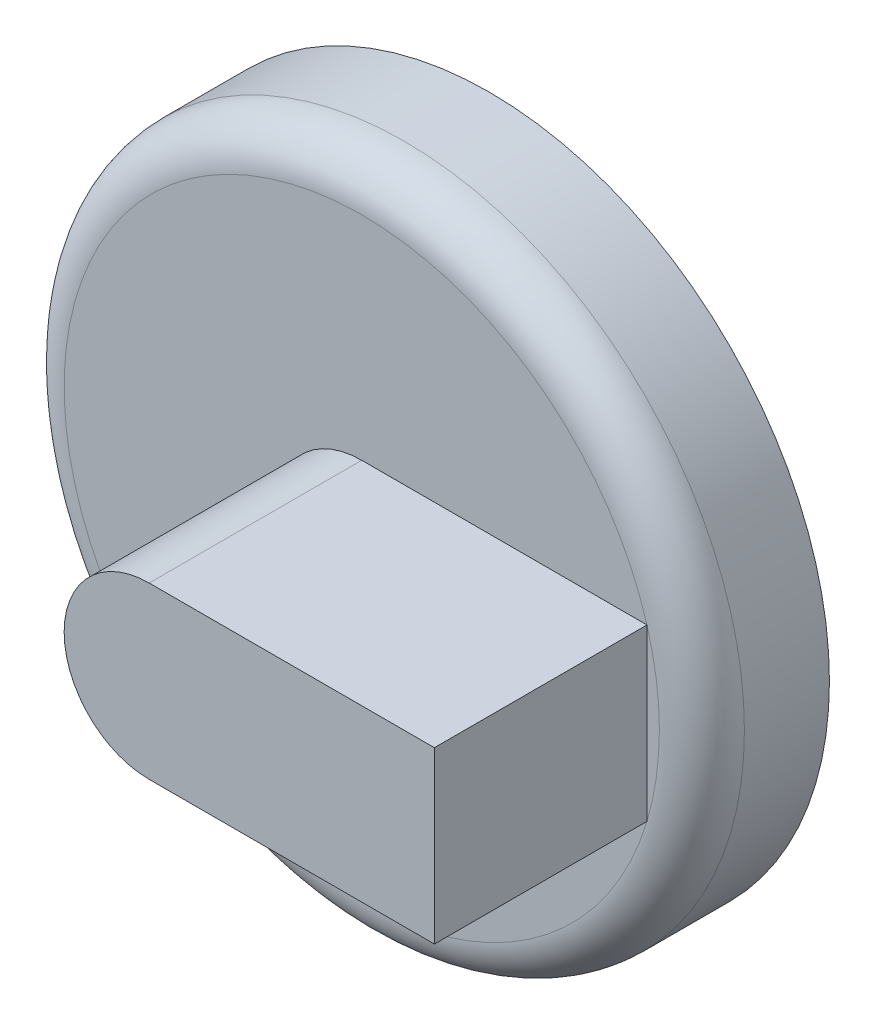
ISO-10303-21;
HEADER;
FILE_DESCRIPTION(('STEP AP214'),'2;1');
FILE_NAME('part.step','',(''),(''),'','','');
FILE_SCHEMA(('AUTOMOTIVE_DESIGN { 1 0 10303 214 1 1 1 1 }'));
ENDSEC;
DATA;
#1=APPLICATION_CONTEXT('core data for automotive mechanical design processes');
#2=APPLICATION_PROTOCOL_DEFINITION('international standard','automotive_design',2000,#1);
#3=PRODUCT_CONTEXT('',#1,'mechanical');
#4=PRODUCT('Part','Part','',(#3));
#5=PRODUCT_RELATED_PRODUCT_CATEGORY('part','',(#4));
#6=PRODUCT_DEFINITION_FORMATION('','',#4);
#7=PRODUCT_DEFINITION_CONTEXT('part definition',#1,'design');
#8=PRODUCT_DEFINITION('design','',#6,#7);
#9=PRODUCT_DEFINITION_SHAPE('','',#8);
#10=(LENGTH_UNIT() NAMED_UNIT(*) SI_UNIT(.MILLI.,.METRE.));
#11=(NAMED_UNIT(*) PLANE_ANGLE_UNIT() SI_UNIT($,.RADIAN.));
#12=(NAMED_UNIT(*) SI_UNIT($,.STERADIAN.) SOLID_ANGLE_UNIT());
#13=UNCERTAINTY_MEASURE_WITH_UNIT(LENGTH_MEASURE(1.E-05),#10,'distance_accuracy_value','');
#14=(GEOMETRIC_REPRESENTATION_CONTEXT(3) GLOBAL_UNCERTAINTY_ASSIGNED_CONTEXT((#13)) GLOBAL_UNIT_ASSIGNED_CONTEXT((#10,
#11,#12)) REPRESENTATION_CONTEXT('',''));
#15=CARTESIAN_POINT('',(0.,0.,0.));
#16=DIRECTION('',(0.,0.,1.));
#17=DIRECTION('',(1.,0.,0.));
#18=AXIS2_PLACEMENT_3D('',#15,#16,#17);
#19=CARTESIAN_POINT('',(0.,0.,20.6849186801268));
#20=DIRECTION('',(0.,0.,1.));
#21=DIRECTION('',(1.,0.,0.));
#22=AXIS2_PLACEMENT_3D('',#19,#20,#21);
#23=PLANE('',#22);
#24=DIRECTION('',(-1.,0.,0.));
#25=VECTOR('',#24,1.);
#26=CARTESIAN_POINT('',(0.,20.,20.6849186801268));
#27=LINE('',#26,#25);
#28=CARTESIAN_POINT('',(67.0820393249937,20.,20.6849186801268));
#29=VERTEX_POINT('',#28);
#30=CARTESIAN_POINT('',(0.,20.,20.6849186801268));
#31=VERTEX_POINT('',#30);
#32=EDGE_CURVE('E64',#29,#31,#27,.T.);
#33=ORIENTED_EDGE('',*,*,#32,.F.);
#34=CARTESIAN_POINT('',(0.,0.,20.6849186801268));
#35=DIRECTION('',(0.,0.,1.));
#36=DIRECTION('',(1.,0.,0.));
#37=AXIS2_PLACEMENT_3D('',#34,#35,#36);
#38=CIRCLE('',#37,70.);
#39=CARTESIAN_POINT('',(67.0820393249937,-20.,20.6849186801268));
#40=VERTEX_POINT('',#39);
#41=EDGE_CURVE('E49',#29,#40,#38,.T.);
#42=ORIENTED_EDGE('',*,*,#41,.T.);
#43=DIRECTION('',(1.,0.,0.));
#44=VECTOR('',#43,1.);
#45=CARTESIAN_POINT('',(0.,-20.,20.6849186801268));
#46=LINE('',#45,#44);
#47=CARTESIAN_POINT('',(0.,-20.,20.6849186801268));
#48=VERTEX_POINT('',#47);
#49=EDGE_CURVE('E97',#48,#40,#46,.T.);
#50=ORIENTED_EDGE('',*,*,#49,.F.);
#51=CARTESIAN_POINT('',(0.,0.,20.6849186801268));
#52=DIRECTION('',(0.,0.,1.));
#53=DIRECTION('',(1.,0.,0.));
#54=AXIS2_PLACEMENT_3D('',#51,#52,#53);
#55=CIRCLE('',#54,20.);
#56=EDGE_CURVE('E117',#31,#48,#55,.T.);
#57=ORIENTED_EDGE('',*,*,#56,.F.);
#58=EDGE_LOOP('',(#33,#42,#50,#57));
#59=FACE_BOUND('',#58,.T.);
#60=ADVANCED_FACE('F41',(#59),#23,.T.);
#61=CARTESIAN_POINT('',(0.,0.,20.6849186801268));
#62=DIRECTION('',(0.,0.,-1.));
#63=DIRECTION('',(-1.,0.,0.));
#64=AXIS2_PLACEMENT_3D('',#61,#62,#63);
#65=CYLINDRICAL_SURFACE('',#64,80.);
#66=CARTESIAN_POINT('',(0.,0.,10.6849186801268));
#67=DIRECTION('',(0.,0.,1.));
#68=DIRECTION('',(1.,0.,0.));
#69=AXIS2_PLACEMENT_3D('',#66,#67,#68);
#70=CIRCLE('',#69,80.);
#71=CARTESIAN_POINT('',(80.,0.,10.6849186801268));
#72=VERTEX_POINT('',#71);
#73=EDGE_CURVE('E11',#72,#72,#70,.F.);
#74=ORIENTED_EDGE('',*,*,#73,.T.);
#75=EDGE_LOOP('',(#74));
#76=FACE_BOUND('',#75,.T.);
#77=CARTESIAN_POINT('',(0.,0.,-9.31508131987322));
#78=DIRECTION('',(0.,0.,1.));
#79=DIRECTION('',(1.,0.,0.));
#80=AXIS2_PLACEMENT_3D('',#77,#78,#79);
#81=CIRCLE('',#80,80.);
#82=CARTESIAN_POINT('',(80.,0.,-9.31508131987322));
#83=VERTEX_POINT('',#82);
#84=EDGE_CURVE('E112',#83,#83,#81,.T.);
#85=ORIENTED_EDGE('',*,*,#84,.T.);
#86=EDGE_LOOP('',(#85));
#87=FACE_BOUND('',#86,.T.);
#88=ADVANCED_FACE('F142',(#76,#87),#65,.T.);
#89=DIRECTION('',(0.,1.,0.));
#90=VECTOR('',#89,1.);
#91=CARTESIAN_POINT('',(67.0820393249937,20.,20.6849186801268));
#92=LINE('',#91,#90);
#93=EDGE_CURVE('E93',#40,#29,#92,.T.);
#94=ORIENTED_EDGE('',*,*,#93,.F.);
#95=EDGE_CURVE('E108',#40,#29,#38,.T.);
#96=ORIENTED_EDGE('',*,*,#95,.T.);
#97=EDGE_LOOP('',(#94,#96));
#98=FACE_BOUND('',#97,.T.);
#99=ADVANCED_FACE('F107',(#98),#23,.T.);
#100=CARTESIAN_POINT('',(0.,0.,-9.31508131987322));
#101=DIRECTION('',(0.,0.,1.));
#102=DIRECTION('',(1.,0.,0.));
#103=AXIS2_PLACEMENT_3D('',#100,#101,#102);
#104=PLANE('',#103);
#105=ORIENTED_EDGE('',*,*,#84,.F.);
#106=EDGE_LOOP('',(#105));
#107=FACE_BOUND('',#106,.T.);
#108=ADVANCED_FACE('F152',(#107),#104,.F.);
#109=CARTESIAN_POINT('',(0.,0.,10.6849186801268));
#110=DIRECTION('',(0.,0.,1.));
#111=DIRECTION('',(1.,0.,0.));
#112=AXIS2_PLACEMENT_3D('',#109,#110,#111);
#113=TOROIDAL_SURFACE('',#112,70.,10.);
#114=ORIENTED_EDGE('',*,*,#73,.F.);
#115=EDGE_LOOP('',(#114));
#116=FACE_BOUND('',#115,.T.);
#117=ORIENTED_EDGE('',*,*,#41,.F.);
#118=ORIENTED_EDGE('',*,*,#95,.F.);
#119=EDGE_LOOP('',(#117,#118));
#120=FACE_BOUND('',#119,.T.);
#121=ADVANCED_FACE('F43',(#116,#120),#113,.T.);
#122=CARTESIAN_POINT('',(0.,0.,70.6849186801268));
#123=DIRECTION('',(0.,0.,-1.));
#124=DIRECTION('',(-1.,0.,0.));
#125=AXIS2_PLACEMENT_3D('',#122,#123,#124);
#126=CYLINDRICAL_SURFACE('',#125,20.);
#127=CARTESIAN_POINT('',(0.,0.,70.6849186801268));
#128=DIRECTION('',(0.,0.,1.));
#129=DIRECTION('',(1.,0.,0.));
#130=AXIS2_PLACEMENT_3D('',#127,#128,#129);
#131=CIRCLE('',#130,20.);
#132=CARTESIAN_POINT('',(0.,20.,70.6849186801268));
#133=VERTEX_POINT('',#132);
#134=CARTESIAN_POINT('',(0.,-20.,70.6849186801268));
#135=VERTEX_POINT('',#134);
#136=EDGE_CURVE('E116',#133,#135,#131,.T.);
#137=ORIENTED_EDGE('',*,*,#136,.F.);
#138=DIRECTION('',(0.,0.,1.));
#139=VECTOR('',#138,1.);
#140=CARTESIAN_POINT('',(0.,20.,20.6849186801268));
#141=LINE('',#140,#139);
#142=EDGE_CURVE('E119',#31,#133,#141,.T.);
#143=ORIENTED_EDGE('',*,*,#142,.F.);
#144=ORIENTED_EDGE('',*,*,#56,.T.);
#145=DIRECTION('',(0.,0.,1.));
#146=VECTOR('',#145,1.);
#147=CARTESIAN_POINT('',(0.,-20.,20.6849186801268));
#148=LINE('',#147,#146);
#149=EDGE_CURVE('E87',#48,#135,#148,.T.);
#150=ORIENTED_EDGE('',*,*,#149,.T.);
#151=EDGE_LOOP('',(#137,#143,#144,#150));
#152=FACE_BOUND('',#151,.T.);
#153=ADVANCED_FACE('F131',(#152),#126,.T.);
#154=CARTESIAN_POINT('',(0.,0.,70.6849186801268));
#155=DIRECTION('',(0.,0.,1.));
#156=DIRECTION('',(1.,0.,0.));
#157=AXIS2_PLACEMENT_3D('',#154,#155,#156);
#158=PLANE('',#157);
#159=ORIENTED_EDGE('',*,*,#136,.T.);
#160=DIRECTION('',(1.,0.,0.));
#161=VECTOR('',#160,1.);
#162=CARTESIAN_POINT('',(0.,-20.,70.6849186801268));
#163=LINE('',#162,#161);
#164=CARTESIAN_POINT('',(67.0820393249937,-20.,70.6849186801268));
#165=VERTEX_POINT('',#164);
#166=EDGE_CURVE('E126',#135,#165,#163,.T.);
#167=ORIENTED_EDGE('',*,*,#166,.T.);
#168=DIRECTION('',(0.,1.,0.));
#169=VECTOR('',#168,1.);
#170=CARTESIAN_POINT('',(67.0820393249937,20.,70.6849186801268));
#171=LINE('',#170,#169);
#172=CARTESIAN_POINT('',(67.0820393249937,20.,70.6849186801268));
#173=VERTEX_POINT('',#172);
#174=EDGE_CURVE('E94',#165,#173,#171,.T.);
#175=ORIENTED_EDGE('',*,*,#174,.T.);
#176=DIRECTION('',(-1.,0.,0.));
#177=VECTOR('',#176,1.);
#178=CARTESIAN_POINT('',(0.,20.,70.6849186801268));
#179=LINE('',#178,#177);
#180=EDGE_CURVE('E56',#173,#133,#179,.T.);
#181=ORIENTED_EDGE('',*,*,#180,.T.);
#182=EDGE_LOOP('',(#159,#167,#175,#181));
#183=FACE_BOUND('',#182,.T.);
#184=ADVANCED_FACE('F128',(#183),#158,.T.);
#185=CARTESIAN_POINT('',(0.,20.,20.6849186801268));
#186=DIRECTION('',(0.,1.,0.));
#187=DIRECTION('',(0.,0.,1.));
#188=AXIS2_PLACEMENT_3D('',#185,#186,#187);
#189=PLANE('',#188);
#190=ORIENTED_EDGE('',*,*,#180,.F.);
#191=DIRECTION('',(0.,0.,1.));
#192=VECTOR('',#191,1.);
#193=CARTESIAN_POINT('',(67.0820393249937,20.,20.6849186801268));
#194=LINE('',#193,#192);
#195=EDGE_CURVE('E81',#29,#173,#194,.T.);
#196=ORIENTED_EDGE('',*,*,#195,.F.);
#197=ORIENTED_EDGE('',*,*,#32,.T.);
#198=ORIENTED_EDGE('',*,*,#142,.T.);
#199=EDGE_LOOP('',(#190,#196,#197,#198));
#200=FACE_BOUND('',#199,.T.);
#201=ADVANCED_FACE('F132',(#200),#189,.T.);
#202=CARTESIAN_POINT('',(67.0820393249937,20.,20.6849186801268));
#203=DIRECTION('',(1.,0.,0.));
#204=DIRECTION('',(0.,0.,-1.));
#205=AXIS2_PLACEMENT_3D('',#202,#203,#204);
#206=PLANE('',#205);
#207=ORIENTED_EDGE('',*,*,#174,.F.);
#208=DIRECTION('',(0.,0.,1.));
#209=VECTOR('',#208,1.);
#210=CARTESIAN_POINT('',(67.0820393249937,-20.,20.6849186801268));
#211=LINE('',#210,#209);
#212=EDGE_CURVE('E90',#40,#165,#211,.T.);
#213=ORIENTED_EDGE('',*,*,#212,.F.);
#214=ORIENTED_EDGE('',*,*,#93,.T.);
#215=ORIENTED_EDGE('',*,*,#195,.T.);
#216=EDGE_LOOP('',(#207,#213,#214,#215));
#217=FACE_BOUND('',#216,.T.);
#218=ADVANCED_FACE('F91',(#217),#206,.T.);
#219=CARTESIAN_POINT('',(0.,-20.,20.6849186801268));
#220=DIRECTION('',(0.,-1.,0.));
#221=DIRECTION('',(0.,0.,-1.));
#222=AXIS2_PLACEMENT_3D('',#219,#220,#221);
#223=PLANE('',#222);
#224=ORIENTED_EDGE('',*,*,#166,.F.);
#225=ORIENTED_EDGE('',*,*,#149,.F.);
#226=ORIENTED_EDGE('',*,*,#49,.T.);
#227=ORIENTED_EDGE('',*,*,#212,.T.);
#228=EDGE_LOOP('',(#224,#225,#226,#227));
#229=FACE_BOUND('',#228,.T.);
#230=ADVANCED_FACE('F98',(#229),#223,.T.);
#231=CLOSED_SHELL('',(#60,#88,#99,#108,#121,#153,#184,#201,#218,#230));
#232=MANIFOLD_SOLID_BREP('B2',#231);
#233=ADVANCED_BREP_SHAPE_REPRESENTATION('',(#18,#232),#14);
#234=SHAPE_DEFINITION_REPRESENTATION(#9,#233);
ENDSEC;
END-ISO-10303-21;
